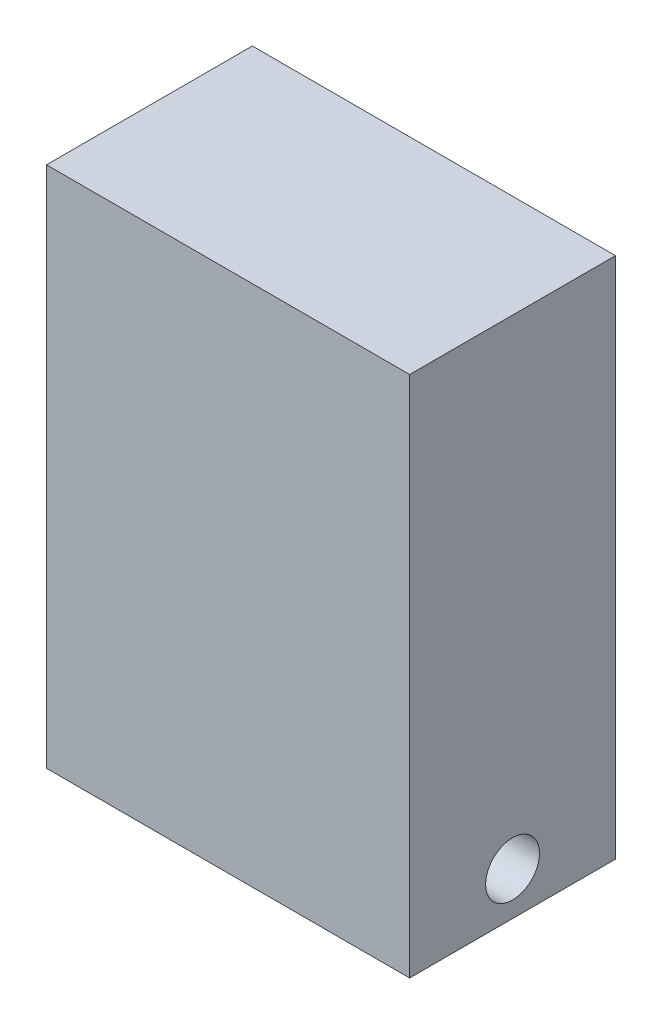
ISO-10303-21;
HEADER;
FILE_DESCRIPTION(('STEP AP214'),'2;1');
FILE_NAME('part.step','',(''),(''),'','','');
FILE_SCHEMA(('AUTOMOTIVE_DESIGN { 1 0 10303 214 1 1 1 1 }'));
ENDSEC;
DATA;
#1=APPLICATION_CONTEXT('core data for automotive mechanical design processes');
#2=APPLICATION_PROTOCOL_DEFINITION('international standard','automotive_design',2000,#1);
#3=PRODUCT_CONTEXT('',#1,'mechanical');
#4=PRODUCT('Part','Part','',(#3));
#5=PRODUCT_RELATED_PRODUCT_CATEGORY('part','',(#4));
#6=PRODUCT_DEFINITION_FORMATION('','',#4);
#7=PRODUCT_DEFINITION_CONTEXT('part definition',#1,'design');
#8=PRODUCT_DEFINITION('design','',#6,#7);
#9=PRODUCT_DEFINITION_SHAPE('','',#8);
#10=(LENGTH_UNIT() NAMED_UNIT(*) SI_UNIT(.MILLI.,.METRE.));
#11=(NAMED_UNIT(*) PLANE_ANGLE_UNIT() SI_UNIT($,.RADIAN.));
#12=(NAMED_UNIT(*) SI_UNIT($,.STERADIAN.) SOLID_ANGLE_UNIT());
#13=UNCERTAINTY_MEASURE_WITH_UNIT(LENGTH_MEASURE(1.E-05),#10,'distance_accuracy_value','');
#14=(GEOMETRIC_REPRESENTATION_CONTEXT(3) GLOBAL_UNCERTAINTY_ASSIGNED_CONTEXT((#13)) GLOBAL_UNIT_ASSIGNED_CONTEXT((#10,
#11,#12)) REPRESENTATION_CONTEXT('',''));
#15=CARTESIAN_POINT('',(0.,0.,0.));
#16=DIRECTION('',(0.,0.,1.));
#17=DIRECTION('',(1.,0.,0.));
#18=AXIS2_PLACEMENT_3D('',#15,#16,#17);
#19=CARTESIAN_POINT('',(0.,0.,48.514));
#20=DIRECTION('',(1.,0.,0.));
#21=DIRECTION('',(0.,0.,-1.));
#22=AXIS2_PLACEMENT_3D('',#19,#20,#21);
#23=PLANE('',#22);
#24=CARTESIAN_POINT('',(0.,10.16,24.257));
#25=DIRECTION('',(1.,0.,0.));
#26=DIRECTION('',(0.,0.,-1.));
#27=AXIS2_PLACEMENT_3D('',#24,#25,#26);
#28=CIRCLE('',#27,6.35);
#29=CARTESIAN_POINT('',(0.,10.16,17.907));
#30=VERTEX_POINT('',#29);
#31=EDGE_CURVE('E117',#30,#30,#28,.T.);
#32=ORIENTED_EDGE('',*,*,#31,.T.);
#33=EDGE_LOOP('',(#32));
#34=FACE_BOUND('',#33,.T.);
#35=DIRECTION('',(0.,-1.,0.));
#36=VECTOR('',#35,1.);
#37=CARTESIAN_POINT('',(0.,0.,0.));
#38=LINE('',#37,#36);
#39=CARTESIAN_POINT('',(0.,123.19,0.));
#40=VERTEX_POINT('',#39);
#41=CARTESIAN_POINT('',(0.,0.,0.));
#42=VERTEX_POINT('',#41);
#43=EDGE_CURVE('E113',#40,#42,#38,.T.);
#44=ORIENTED_EDGE('',*,*,#43,.T.);
#45=DIRECTION('',(0.,0.,-1.));
#46=VECTOR('',#45,1.);
#47=CARTESIAN_POINT('',(0.,0.,48.514));
#48=LINE('',#47,#46);
#49=CARTESIAN_POINT('',(0.,0.,48.514));
#50=VERTEX_POINT('',#49);
#51=EDGE_CURVE('E11',#50,#42,#48,.T.);
#52=ORIENTED_EDGE('',*,*,#51,.F.);
#53=DIRECTION('',(0.,-1.,0.));
#54=VECTOR('',#53,1.);
#55=CARTESIAN_POINT('',(0.,0.,48.514));
#56=LINE('',#55,#54);
#57=CARTESIAN_POINT('',(0.,123.19,48.514));
#58=VERTEX_POINT('',#57);
#59=EDGE_CURVE('E97',#58,#50,#56,.T.);
#60=ORIENTED_EDGE('',*,*,#59,.F.);
#61=DIRECTION('',(0.,0.,-1.));
#62=VECTOR('',#61,1.);
#63=CARTESIAN_POINT('',(0.,123.19,48.514));
#64=LINE('',#63,#62);
#65=EDGE_CURVE('E109',#58,#40,#64,.T.);
#66=ORIENTED_EDGE('',*,*,#65,.T.);
#67=EDGE_LOOP('',(#44,#52,#60,#66));
#68=FACE_BOUND('',#67,.T.);
#69=ADVANCED_FACE('F45',(#34,#68),#23,.F.);
#70=CARTESIAN_POINT('',(0.,0.,48.514));
#71=DIRECTION('',(0.,1.,0.));
#72=DIRECTION('',(0.,0.,1.));
#73=AXIS2_PLACEMENT_3D('',#70,#71,#72);
#74=PLANE('',#73);
#75=DIRECTION('',(1.,0.,0.));
#76=VECTOR('',#75,1.);
#77=CARTESIAN_POINT('',(0.,0.,0.));
#78=LINE('',#77,#76);
#79=CARTESIAN_POINT('',(85.598,0.,0.));
#80=VERTEX_POINT('',#79);
#81=EDGE_CURVE('E102',#42,#80,#78,.T.);
#82=ORIENTED_EDGE('',*,*,#81,.T.);
#83=DIRECTION('',(0.,0.,-1.));
#84=VECTOR('',#83,1.);
#85=CARTESIAN_POINT('',(85.598,0.,48.514));
#86=LINE('',#85,#84);
#87=CARTESIAN_POINT('',(85.598,0.,48.514));
#88=VERTEX_POINT('',#87);
#89=EDGE_CURVE('E54',#88,#80,#86,.T.);
#90=ORIENTED_EDGE('',*,*,#89,.F.);
#91=DIRECTION('',(1.,0.,0.));
#92=VECTOR('',#91,1.);
#93=CARTESIAN_POINT('',(0.,0.,48.514));
#94=LINE('',#93,#92);
#95=EDGE_CURVE('E92',#50,#88,#94,.T.);
#96=ORIENTED_EDGE('',*,*,#95,.F.);
#97=ORIENTED_EDGE('',*,*,#51,.T.);
#98=EDGE_LOOP('',(#82,#90,#96,#97));
#99=FACE_BOUND('',#98,.T.);
#100=ADVANCED_FACE('F101',(#99),#74,.F.);
#101=CARTESIAN_POINT('',(85.598,0.,48.514));
#102=DIRECTION('',(-1.,0.,0.));
#103=DIRECTION('',(0.,0.,1.));
#104=AXIS2_PLACEMENT_3D('',#101,#102,#103);
#105=PLANE('',#104);
#106=CARTESIAN_POINT('',(85.598,10.16,24.257));
#107=DIRECTION('',(-1.,0.,0.));
#108=DIRECTION('',(0.,0.,1.));
#109=AXIS2_PLACEMENT_3D('',#106,#107,#108);
#110=CIRCLE('',#109,6.35);
#111=CARTESIAN_POINT('',(85.598,10.16,30.607));
#112=VERTEX_POINT('',#111);
#113=EDGE_CURVE('E137',#112,#112,#110,.T.);
#114=ORIENTED_EDGE('',*,*,#113,.T.);
#115=EDGE_LOOP('',(#114));
#116=FACE_BOUND('',#115,.T.);
#117=DIRECTION('',(0.,1.,0.));
#118=VECTOR('',#117,1.);
#119=CARTESIAN_POINT('',(85.598,0.,0.));
#120=LINE('',#119,#118);
#121=CARTESIAN_POINT('',(85.598,123.19,0.));
#122=VERTEX_POINT('',#121);
#123=EDGE_CURVE('E79',#80,#122,#120,.T.);
#124=ORIENTED_EDGE('',*,*,#123,.T.);
#125=DIRECTION('',(0.,0.,-1.));
#126=VECTOR('',#125,1.);
#127=CARTESIAN_POINT('',(85.598,123.19,48.514));
#128=LINE('',#127,#126);
#129=CARTESIAN_POINT('',(85.598,123.19,48.514));
#130=VERTEX_POINT('',#129);
#131=EDGE_CURVE('E104',#130,#122,#128,.T.);
#132=ORIENTED_EDGE('',*,*,#131,.F.);
#133=DIRECTION('',(0.,1.,0.));
#134=VECTOR('',#133,1.);
#135=CARTESIAN_POINT('',(85.598,0.,48.514));
#136=LINE('',#135,#134);
#137=EDGE_CURVE('E95',#88,#130,#136,.T.);
#138=ORIENTED_EDGE('',*,*,#137,.F.);
#139=ORIENTED_EDGE('',*,*,#89,.T.);
#140=EDGE_LOOP('',(#124,#132,#138,#139));
#141=FACE_BOUND('',#140,.T.);
#142=ADVANCED_FACE('F105',(#116,#141),#105,.F.);
#143=CARTESIAN_POINT('',(0.,123.19,48.514));
#144=DIRECTION('',(0.,-1.,0.));
#145=DIRECTION('',(0.,0.,-1.));
#146=AXIS2_PLACEMENT_3D('',#143,#144,#145);
#147=PLANE('',#146);
#148=DIRECTION('',(-1.,0.,0.));
#149=VECTOR('',#148,1.);
#150=CARTESIAN_POINT('',(0.,123.19,0.));
#151=LINE('',#150,#149);
#152=EDGE_CURVE('E85',#122,#40,#151,.T.);
#153=ORIENTED_EDGE('',*,*,#152,.T.);
#154=ORIENTED_EDGE('',*,*,#65,.F.);
#155=DIRECTION('',(-1.,0.,0.));
#156=VECTOR('',#155,1.);
#157=CARTESIAN_POINT('',(0.,123.19,48.514));
#158=LINE('',#157,#156);
#159=EDGE_CURVE('E62',#130,#58,#158,.T.);
#160=ORIENTED_EDGE('',*,*,#159,.F.);
#161=ORIENTED_EDGE('',*,*,#131,.T.);
#162=EDGE_LOOP('',(#153,#154,#160,#161));
#163=FACE_BOUND('',#162,.T.);
#164=ADVANCED_FACE('F127',(#163),#147,.F.);
#165=CARTESIAN_POINT('',(0.,0.,48.514));
#166=DIRECTION('',(0.,0.,-1.));
#167=DIRECTION('',(-1.,0.,0.));
#168=AXIS2_PLACEMENT_3D('',#165,#166,#167);
#169=PLANE('',#168);
#170=ORIENTED_EDGE('',*,*,#59,.T.);
#171=ORIENTED_EDGE('',*,*,#95,.T.);
#172=ORIENTED_EDGE('',*,*,#137,.T.);
#173=ORIENTED_EDGE('',*,*,#159,.T.);
#174=EDGE_LOOP('',(#170,#171,#172,#173));
#175=FACE_BOUND('',#174,.T.);
#176=ADVANCED_FACE('F93',(#175),#169,.F.);
#177=CARTESIAN_POINT('',(0.,0.,0.));
#178=DIRECTION('',(0.,0.,-1.));
#179=DIRECTION('',(-1.,0.,0.));
#180=AXIS2_PLACEMENT_3D('',#177,#178,#179);
#181=PLANE('',#180);
#182=ORIENTED_EDGE('',*,*,#43,.F.);
#183=ORIENTED_EDGE('',*,*,#152,.F.);
#184=ORIENTED_EDGE('',*,*,#123,.F.);
#185=ORIENTED_EDGE('',*,*,#81,.F.);
#186=EDGE_LOOP('',(#182,#183,#184,#185));
#187=FACE_BOUND('',#186,.T.);
#188=ADVANCED_FACE('F130',(#187),#181,.T.);
#189=CARTESIAN_POINT('',(85.598,10.16,24.257));
#190=DIRECTION('',(-1.,0.,0.));
#191=DIRECTION('',(0.,0.,1.));
#192=AXIS2_PLACEMENT_3D('',#189,#190,#191);
#193=CYLINDRICAL_SURFACE('',#192,6.35);
#194=ORIENTED_EDGE('',*,*,#113,.F.);
#195=EDGE_LOOP('',(#194));
#196=FACE_BOUND('',#195,.T.);
#197=ORIENTED_EDGE('',*,*,#31,.F.);
#198=EDGE_LOOP('',(#197));
#199=FACE_BOUND('',#198,.T.);
#200=ADVANCED_FACE('F143',(#196,#199),#193,.F.);
#201=CLOSED_SHELL('',(#69,#100,#142,#164,#176,#188,#200));
#202=MANIFOLD_SOLID_BREP('B2',#201);
#203=ADVANCED_BREP_SHAPE_REPRESENTATION('',(#18,#202),#14);
#204=SHAPE_DEFINITION_REPRESENTATION(#9,#203);
ENDSEC;
END-ISO-10303-21;
